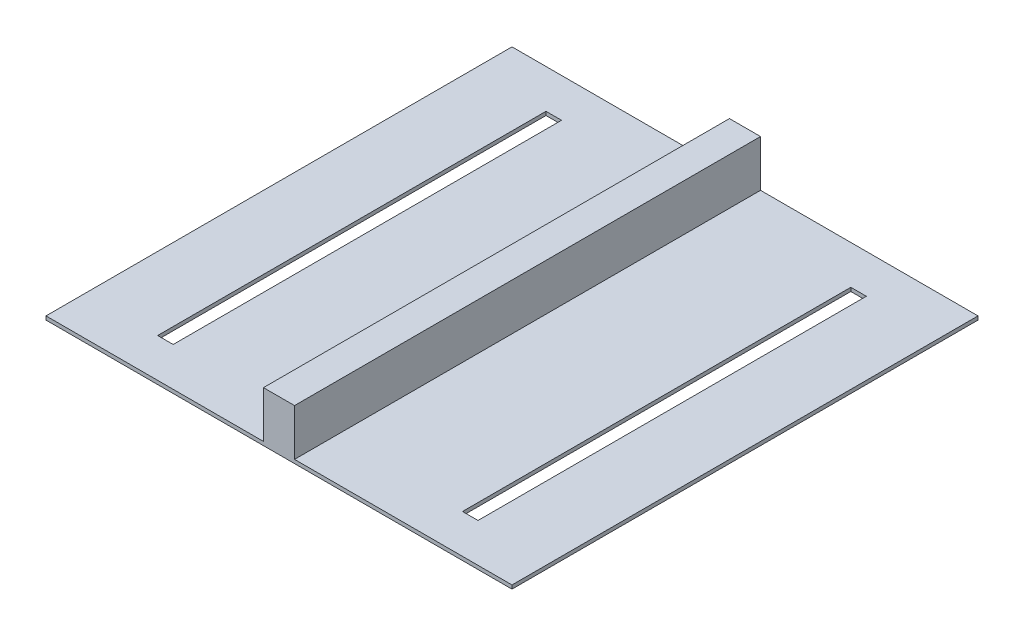
ISO-10303-21;
HEADER;
FILE_DESCRIPTION(('STEP AP214'),'2;1');
FILE_NAME('part.step','',(''),(''),'','','');
FILE_SCHEMA(('AUTOMOTIVE_DESIGN { 1 0 10303 214 1 1 1 1 }'));
ENDSEC;
DATA;
#1=APPLICATION_CONTEXT('core data for automotive mechanical design processes');
#2=APPLICATION_PROTOCOL_DEFINITION('international standard','automotive_design',2000,#1);
#3=PRODUCT_CONTEXT('',#1,'mechanical');
#4=PRODUCT('Part','Part','',(#3));
#5=PRODUCT_RELATED_PRODUCT_CATEGORY('part','',(#4));
#6=PRODUCT_DEFINITION_FORMATION('','',#4);
#7=PRODUCT_DEFINITION_CONTEXT('part definition',#1,'design');
#8=PRODUCT_DEFINITION('design','',#6,#7);
#9=PRODUCT_DEFINITION_SHAPE('','',#8);
#10=(LENGTH_UNIT() NAMED_UNIT(*) SI_UNIT(.MILLI.,.METRE.));
#11=(NAMED_UNIT(*) PLANE_ANGLE_UNIT() SI_UNIT($,.RADIAN.));
#12=(NAMED_UNIT(*) SI_UNIT($,.STERADIAN.) SOLID_ANGLE_UNIT());
#13=UNCERTAINTY_MEASURE_WITH_UNIT(LENGTH_MEASURE(1.E-05),#10,'distance_accuracy_value','');
#14=(GEOMETRIC_REPRESENTATION_CONTEXT(3) GLOBAL_UNCERTAINTY_ASSIGNED_CONTEXT((#13)) GLOBAL_UNIT_ASSIGNED_CONTEXT((#10,
#11,#12)) REPRESENTATION_CONTEXT('',''));
#15=CARTESIAN_POINT('',(0.,0.,0.));
#16=DIRECTION('',(0.,0.,1.));
#17=DIRECTION('',(1.,0.,0.));
#18=AXIS2_PLACEMENT_3D('',#15,#16,#17);
#19=CARTESIAN_POINT('',(0.,3.,0.));
#20=DIRECTION('',(0.,1.,0.));
#21=DIRECTION('',(0.,0.,1.));
#22=AXIS2_PLACEMENT_3D('',#19,#20,#21);
#23=PLANE('',#22);
#24=DIRECTION('',(0.,0.,1.));
#25=VECTOR('',#24,1.);
#26=CARTESIAN_POINT('',(-25.4,3.,-381.));
#27=LINE('',#26,#25);
#28=CARTESIAN_POINT('',(-25.4,3.,-381.));
#29=VERTEX_POINT('',#28);
#30=CARTESIAN_POINT('',(-25.4,3.,381.));
#31=VERTEX_POINT('',#30);
#32=EDGE_CURVE('E57',#29,#31,#27,.T.);
#33=ORIENTED_EDGE('',*,*,#32,.F.);
#34=DIRECTION('',(-1.,0.,0.));
#35=VECTOR('',#34,1.);
#36=CARTESIAN_POINT('',(-381.,3.,-381.));
#37=LINE('',#36,#35);
#38=CARTESIAN_POINT('',(-381.,3.,-381.));
#39=VERTEX_POINT('',#38);
#40=EDGE_CURVE('E284',#29,#39,#37,.T.);
#41=ORIENTED_EDGE('',*,*,#40,.T.);
#42=DIRECTION('',(0.,0.,1.));
#43=VECTOR('',#42,1.);
#44=CARTESIAN_POINT('',(-381.,3.,-381.));
#45=LINE('',#44,#43);
#46=CARTESIAN_POINT('',(-381.,3.,381.));
#47=VERTEX_POINT('',#46);
#48=EDGE_CURVE('E272',#39,#47,#45,.T.);
#49=ORIENTED_EDGE('',*,*,#48,.T.);
#50=DIRECTION('',(1.,0.,0.));
#51=VECTOR('',#50,1.);
#52=CARTESIAN_POINT('',(-381.,3.,381.));
#53=LINE('',#52,#51);
#54=EDGE_CURVE('E278',#47,#31,#53,.T.);
#55=ORIENTED_EDGE('',*,*,#54,.T.);
#56=EDGE_LOOP('',(#33,#41,#49,#55));
#57=FACE_BOUND('',#56,.T.);
#58=DIRECTION('',(1.,0.,0.));
#59=VECTOR('',#58,1.);
#60=CARTESIAN_POINT('',(-261.9248,3.,317.5));
#61=LINE('',#60,#59);
#62=CARTESIAN_POINT('',(-261.9248,3.,317.5));
#63=VERTEX_POINT('',#62);
#64=CARTESIAN_POINT('',(-236.5248,3.,317.5));
#65=VERTEX_POINT('',#64);
#66=EDGE_CURVE('E232',#63,#65,#61,.T.);
#67=ORIENTED_EDGE('',*,*,#66,.F.);
#68=DIRECTION('',(0.,0.,1.));
#69=VECTOR('',#68,1.);
#70=CARTESIAN_POINT('',(-261.9248,3.,-317.5));
#71=LINE('',#70,#69);
#72=CARTESIAN_POINT('',(-261.9248,3.,-317.5));
#73=VERTEX_POINT('',#72);
#74=EDGE_CURVE('E229',#73,#63,#71,.T.);
#75=ORIENTED_EDGE('',*,*,#74,.F.);
#76=DIRECTION('',(-1.,0.,0.));
#77=VECTOR('',#76,1.);
#78=CARTESIAN_POINT('',(-261.9248,3.,-317.5));
#79=LINE('',#78,#77);
#80=CARTESIAN_POINT('',(-236.5248,3.,-317.5));
#81=VERTEX_POINT('',#80);
#82=EDGE_CURVE('E240',#81,#73,#79,.T.);
#83=ORIENTED_EDGE('',*,*,#82,.F.);
#84=DIRECTION('',(0.,0.,-1.));
#85=VECTOR('',#84,1.);
#86=CARTESIAN_POINT('',(-236.5248,3.,-317.5));
#87=LINE('',#86,#85);
#88=EDGE_CURVE('E236',#65,#81,#87,.T.);
#89=ORIENTED_EDGE('',*,*,#88,.F.);
#90=EDGE_LOOP('',(#67,#75,#83,#89));
#91=FACE_BOUND('',#90,.T.);
#92=ADVANCED_FACE('F41',(#57,#91),#23,.T.);
#93=DIRECTION('',(0.,0.,-1.));
#94=VECTOR('',#93,1.);
#95=CARTESIAN_POINT('',(25.4,3.,-381.));
#96=LINE('',#95,#94);
#97=CARTESIAN_POINT('',(25.4,3.,381.));
#98=VERTEX_POINT('',#97);
#99=CARTESIAN_POINT('',(25.4,3.,-381.));
#100=VERTEX_POINT('',#99);
#101=EDGE_CURVE('E65',#98,#100,#96,.T.);
#102=ORIENTED_EDGE('',*,*,#101,.F.);
#103=CARTESIAN_POINT('',(381.,3.,381.));
#104=VERTEX_POINT('',#103);
#105=EDGE_CURVE('E276',#98,#104,#53,.T.);
#106=ORIENTED_EDGE('',*,*,#105,.T.);
#107=DIRECTION('',(0.,0.,-1.));
#108=VECTOR('',#107,1.);
#109=CARTESIAN_POINT('',(381.,3.,-381.));
#110=LINE('',#109,#108);
#111=CARTESIAN_POINT('',(381.,3.,-381.));
#112=VERTEX_POINT('',#111);
#113=EDGE_CURVE('E281',#104,#112,#110,.T.);
#114=ORIENTED_EDGE('',*,*,#113,.T.);
#115=EDGE_CURVE('E285',#112,#100,#37,.T.);
#116=ORIENTED_EDGE('',*,*,#115,.T.);
#117=EDGE_LOOP('',(#102,#106,#114,#116));
#118=FACE_BOUND('',#117,.T.);
#119=DIRECTION('',(1.,0.,0.));
#120=VECTOR('',#119,1.);
#121=CARTESIAN_POINT('',(236.5248,3.,317.5));
#122=LINE('',#121,#120);
#123=CARTESIAN_POINT('',(236.5248,3.,317.5));
#124=VERTEX_POINT('',#123);
#125=CARTESIAN_POINT('',(261.9248,3.,317.5));
#126=VERTEX_POINT('',#125);
#127=EDGE_CURVE('E193',#124,#126,#122,.T.);
#128=ORIENTED_EDGE('',*,*,#127,.F.);
#129=DIRECTION('',(0.,0.,1.));
#130=VECTOR('',#129,1.);
#131=CARTESIAN_POINT('',(236.5248,3.,-317.5));
#132=LINE('',#131,#130);
#133=CARTESIAN_POINT('',(236.5248,3.,-317.5));
#134=VERTEX_POINT('',#133);
#135=EDGE_CURVE('E190',#134,#124,#132,.T.);
#136=ORIENTED_EDGE('',*,*,#135,.F.);
#137=DIRECTION('',(-1.,0.,0.));
#138=VECTOR('',#137,1.);
#139=CARTESIAN_POINT('',(236.5248,3.,-317.5));
#140=LINE('',#139,#138);
#141=CARTESIAN_POINT('',(261.9248,3.,-317.5));
#142=VERTEX_POINT('',#141);
#143=EDGE_CURVE('E201',#142,#134,#140,.T.);
#144=ORIENTED_EDGE('',*,*,#143,.F.);
#145=DIRECTION('',(0.,0.,-1.));
#146=VECTOR('',#145,1.);
#147=CARTESIAN_POINT('',(261.9248,3.,-317.5));
#148=LINE('',#147,#146);
#149=EDGE_CURVE('E197',#126,#142,#148,.T.);
#150=ORIENTED_EDGE('',*,*,#149,.F.);
#151=EDGE_LOOP('',(#128,#136,#144,#150));
#152=FACE_BOUND('',#151,.T.);
#153=ADVANCED_FACE('F329',(#118,#152),#23,.T.);
#154=CARTESIAN_POINT('',(0.,-3.,0.));
#155=DIRECTION('',(0.,1.,0.));
#156=DIRECTION('',(0.,0.,1.));
#157=AXIS2_PLACEMENT_3D('',#154,#155,#156);
#158=PLANE('',#157);
#159=DIRECTION('',(0.,0.,1.));
#160=VECTOR('',#159,1.);
#161=CARTESIAN_POINT('',(-261.9248,-3.,-317.5));
#162=LINE('',#161,#160);
#163=CARTESIAN_POINT('',(-261.9248,-3.,-317.5));
#164=VERTEX_POINT('',#163);
#165=CARTESIAN_POINT('',(-261.9248,-3.,317.5));
#166=VERTEX_POINT('',#165);
#167=EDGE_CURVE('E228',#164,#166,#162,.T.);
#168=ORIENTED_EDGE('',*,*,#167,.T.);
#169=DIRECTION('',(1.,0.,0.));
#170=VECTOR('',#169,1.);
#171=CARTESIAN_POINT('',(-261.9248,-3.,317.5));
#172=LINE('',#171,#170);
#173=CARTESIAN_POINT('',(-236.5248,-3.,317.5));
#174=VERTEX_POINT('',#173);
#175=EDGE_CURVE('E247',#166,#174,#172,.T.);
#176=ORIENTED_EDGE('',*,*,#175,.T.);
#177=DIRECTION('',(0.,0.,-1.));
#178=VECTOR('',#177,1.);
#179=CARTESIAN_POINT('',(-236.5248,-3.,-317.5));
#180=LINE('',#179,#178);
#181=CARTESIAN_POINT('',(-236.5248,-3.,-317.5));
#182=VERTEX_POINT('',#181);
#183=EDGE_CURVE('E251',#174,#182,#180,.T.);
#184=ORIENTED_EDGE('',*,*,#183,.T.);
#185=DIRECTION('',(-1.,0.,0.));
#186=VECTOR('',#185,1.);
#187=CARTESIAN_POINT('',(-261.9248,-3.,-317.5));
#188=LINE('',#187,#186);
#189=EDGE_CURVE('E233',#182,#164,#188,.T.);
#190=ORIENTED_EDGE('',*,*,#189,.T.);
#191=EDGE_LOOP('',(#168,#176,#184,#190));
#192=FACE_BOUND('',#191,.T.);
#193=DIRECTION('',(0.,0.,1.));
#194=VECTOR('',#193,1.);
#195=CARTESIAN_POINT('',(-381.,-3.,-381.));
#196=LINE('',#195,#194);
#197=CARTESIAN_POINT('',(-381.,-3.,-381.));
#198=VERTEX_POINT('',#197);
#199=CARTESIAN_POINT('',(-381.,-3.,381.));
#200=VERTEX_POINT('',#199);
#201=EDGE_CURVE('E271',#198,#200,#196,.T.);
#202=ORIENTED_EDGE('',*,*,#201,.F.);
#203=DIRECTION('',(-1.,0.,0.));
#204=VECTOR('',#203,1.);
#205=CARTESIAN_POINT('',(-381.,-3.,-381.));
#206=LINE('',#205,#204);
#207=CARTESIAN_POINT('',(381.,-3.,-381.));
#208=VERTEX_POINT('',#207);
#209=EDGE_CURVE('E277',#208,#198,#206,.T.);
#210=ORIENTED_EDGE('',*,*,#209,.F.);
#211=DIRECTION('',(0.,0.,-1.));
#212=VECTOR('',#211,1.);
#213=CARTESIAN_POINT('',(381.,-3.,-381.));
#214=LINE('',#213,#212);
#215=CARTESIAN_POINT('',(381.,-3.,381.));
#216=VERTEX_POINT('',#215);
#217=EDGE_CURVE('E295',#216,#208,#214,.T.);
#218=ORIENTED_EDGE('',*,*,#217,.F.);
#219=DIRECTION('',(1.,0.,0.));
#220=VECTOR('',#219,1.);
#221=CARTESIAN_POINT('',(-381.,-3.,381.));
#222=LINE('',#221,#220);
#223=EDGE_CURVE('E292',#200,#216,#222,.T.);
#224=ORIENTED_EDGE('',*,*,#223,.F.);
#225=EDGE_LOOP('',(#202,#210,#218,#224));
#226=FACE_BOUND('',#225,.T.);
#227=DIRECTION('',(0.,0.,1.));
#228=VECTOR('',#227,1.);
#229=CARTESIAN_POINT('',(236.5248,-3.,-317.5));
#230=LINE('',#229,#228);
#231=CARTESIAN_POINT('',(236.5248,-3.,-317.5));
#232=VERTEX_POINT('',#231);
#233=CARTESIAN_POINT('',(236.5248,-3.,317.5));
#234=VERTEX_POINT('',#233);
#235=EDGE_CURVE('E179',#232,#234,#230,.T.);
#236=ORIENTED_EDGE('',*,*,#235,.T.);
#237=DIRECTION('',(1.,0.,0.));
#238=VECTOR('',#237,1.);
#239=CARTESIAN_POINT('',(236.5248,-3.,317.5));
#240=LINE('',#239,#238);
#241=CARTESIAN_POINT('',(261.9248,-3.,317.5));
#242=VERTEX_POINT('',#241);
#243=EDGE_CURVE('E184',#234,#242,#240,.T.);
#244=ORIENTED_EDGE('',*,*,#243,.T.);
#245=DIRECTION('',(0.,0.,-1.));
#246=VECTOR('',#245,1.);
#247=CARTESIAN_POINT('',(261.9248,-3.,-317.5));
#248=LINE('',#247,#246);
#249=CARTESIAN_POINT('',(261.9248,-3.,-317.5));
#250=VERTEX_POINT('',#249);
#251=EDGE_CURVE('E208',#242,#250,#248,.T.);
#252=ORIENTED_EDGE('',*,*,#251,.T.);
#253=DIRECTION('',(-1.,0.,0.));
#254=VECTOR('',#253,1.);
#255=CARTESIAN_POINT('',(236.5248,-3.,-317.5));
#256=LINE('',#255,#254);
#257=EDGE_CURVE('E194',#250,#232,#256,.T.);
#258=ORIENTED_EDGE('',*,*,#257,.T.);
#259=EDGE_LOOP('',(#236,#244,#252,#258));
#260=FACE_BOUND('',#259,.T.);
#261=ADVANCED_FACE('F317',(#192,#226,#260),#158,.F.);
#262=CARTESIAN_POINT('',(-381.,3.,-381.));
#263=DIRECTION('',(1.,0.,0.));
#264=DIRECTION('',(0.,0.,-1.));
#265=AXIS2_PLACEMENT_3D('',#262,#263,#264);
#266=PLANE('',#265);
#267=ORIENTED_EDGE('',*,*,#201,.T.);
#268=DIRECTION('',(0.,-1.,0.));
#269=VECTOR('',#268,1.);
#270=CARTESIAN_POINT('',(-381.,3.,381.));
#271=LINE('',#270,#269);
#272=EDGE_CURVE('E11',#47,#200,#271,.T.);
#273=ORIENTED_EDGE('',*,*,#272,.F.);
#274=ORIENTED_EDGE('',*,*,#48,.F.);
#275=DIRECTION('',(0.,-1.,0.));
#276=VECTOR('',#275,1.);
#277=CARTESIAN_POINT('',(-381.,3.,-381.));
#278=LINE('',#277,#276);
#279=EDGE_CURVE('E288',#39,#198,#278,.T.);
#280=ORIENTED_EDGE('',*,*,#279,.T.);
#281=EDGE_LOOP('',(#267,#273,#274,#280));
#282=FACE_BOUND('',#281,.T.);
#283=ADVANCED_FACE('F43',(#282),#266,.F.);
#284=CARTESIAN_POINT('',(-381.,3.,381.));
#285=DIRECTION('',(0.,0.,-1.));
#286=DIRECTION('',(-1.,0.,0.));
#287=AXIS2_PLACEMENT_3D('',#284,#285,#286);
#288=PLANE('',#287);
#289=ORIENTED_EDGE('',*,*,#223,.T.);
#290=DIRECTION('',(0.,-1.,0.));
#291=VECTOR('',#290,1.);
#292=CARTESIAN_POINT('',(381.,3.,381.));
#293=LINE('',#292,#291);
#294=EDGE_CURVE('E50',#104,#216,#293,.T.);
#295=ORIENTED_EDGE('',*,*,#294,.F.);
#296=ORIENTED_EDGE('',*,*,#105,.F.);
#297=DIRECTION('',(0.,-1.,0.));
#298=VECTOR('',#297,1.);
#299=CARTESIAN_POINT('',(25.4000000000001,79.2,381.));
#300=LINE('',#299,#298);
#301=CARTESIAN_POINT('',(25.4000000000001,79.2,381.));
#302=VERTEX_POINT('',#301);
#303=EDGE_CURVE('E161',#302,#98,#300,.T.);
#304=ORIENTED_EDGE('',*,*,#303,.F.);
#305=DIRECTION('',(1.,0.,0.));
#306=VECTOR('',#305,1.);
#307=CARTESIAN_POINT('',(-25.4,79.2,381.));
#308=LINE('',#307,#306);
#309=CARTESIAN_POINT('',(-25.4,79.2,381.));
#310=VERTEX_POINT('',#309);
#311=EDGE_CURVE('E155',#310,#302,#308,.T.);
#312=ORIENTED_EDGE('',*,*,#311,.F.);
#313=DIRECTION('',(0.,-1.,0.));
#314=VECTOR('',#313,1.);
#315=CARTESIAN_POINT('',(-25.4,79.2,381.));
#316=LINE('',#315,#314);
#317=EDGE_CURVE('E159',#310,#31,#316,.T.);
#318=ORIENTED_EDGE('',*,*,#317,.T.);
#319=ORIENTED_EDGE('',*,*,#54,.F.);
#320=ORIENTED_EDGE('',*,*,#272,.T.);
#321=EDGE_LOOP('',(#289,#295,#296,#304,#312,#318,#319,#320));
#322=FACE_BOUND('',#321,.T.);
#323=ADVANCED_FACE('F157',(#322),#288,.F.);
#324=CARTESIAN_POINT('',(381.,3.,-381.));
#325=DIRECTION('',(-1.,0.,0.));
#326=DIRECTION('',(0.,0.,1.));
#327=AXIS2_PLACEMENT_3D('',#324,#325,#326);
#328=PLANE('',#327);
#329=ORIENTED_EDGE('',*,*,#217,.T.);
#330=DIRECTION('',(0.,-1.,0.));
#331=VECTOR('',#330,1.);
#332=CARTESIAN_POINT('',(381.,3.,-381.));
#333=LINE('',#332,#331);
#334=EDGE_CURVE('E303',#112,#208,#333,.T.);
#335=ORIENTED_EDGE('',*,*,#334,.F.);
#336=ORIENTED_EDGE('',*,*,#113,.F.);
#337=ORIENTED_EDGE('',*,*,#294,.T.);
#338=EDGE_LOOP('',(#329,#335,#336,#337));
#339=FACE_BOUND('',#338,.T.);
#340=ADVANCED_FACE('F312',(#339),#328,.F.);
#341=CARTESIAN_POINT('',(-381.,3.,-381.));
#342=DIRECTION('',(0.,0.,1.));
#343=DIRECTION('',(1.,0.,0.));
#344=AXIS2_PLACEMENT_3D('',#341,#342,#343);
#345=PLANE('',#344);
#346=ORIENTED_EDGE('',*,*,#209,.T.);
#347=ORIENTED_EDGE('',*,*,#279,.F.);
#348=ORIENTED_EDGE('',*,*,#40,.F.);
#349=DIRECTION('',(0.,-1.,0.));
#350=VECTOR('',#349,1.);
#351=CARTESIAN_POINT('',(-25.4,79.2,-381.));
#352=LINE('',#351,#350);
#353=CARTESIAN_POINT('',(-25.4,79.2,-381.));
#354=VERTEX_POINT('',#353);
#355=EDGE_CURVE('E338',#354,#29,#352,.T.);
#356=ORIENTED_EDGE('',*,*,#355,.F.);
#357=DIRECTION('',(-1.,0.,0.));
#358=VECTOR('',#357,1.);
#359=CARTESIAN_POINT('',(-25.4,79.2,-381.));
#360=LINE('',#359,#358);
#361=CARTESIAN_POINT('',(25.4,79.2,-381.));
#362=VERTEX_POINT('',#361);
#363=EDGE_CURVE('E171',#362,#354,#360,.T.);
#364=ORIENTED_EDGE('',*,*,#363,.F.);
#365=DIRECTION('',(0.,-1.,0.));
#366=VECTOR('',#365,1.);
#367=CARTESIAN_POINT('',(25.4,79.2,-381.));
#368=LINE('',#367,#366);
#369=EDGE_CURVE('E186',#362,#100,#368,.T.);
#370=ORIENTED_EDGE('',*,*,#369,.T.);
#371=ORIENTED_EDGE('',*,*,#115,.F.);
#372=ORIENTED_EDGE('',*,*,#334,.T.);
#373=EDGE_LOOP('',(#346,#347,#348,#356,#364,#370,#371,#372));
#374=FACE_BOUND('',#373,.T.);
#375=ADVANCED_FACE('F321',(#374),#345,.F.);
#376=CARTESIAN_POINT('',(-261.9248,3.,-317.5));
#377=DIRECTION('',(1.,0.,0.));
#378=DIRECTION('',(0.,0.,-1.));
#379=AXIS2_PLACEMENT_3D('',#376,#377,#378);
#380=PLANE('',#379);
#381=ORIENTED_EDGE('',*,*,#167,.F.);
#382=DIRECTION('',(0.,-1.,0.));
#383=VECTOR('',#382,1.);
#384=CARTESIAN_POINT('',(-261.9248,3.,-317.5));
#385=LINE('',#384,#383);
#386=EDGE_CURVE('E243',#73,#164,#385,.T.);
#387=ORIENTED_EDGE('',*,*,#386,.F.);
#388=ORIENTED_EDGE('',*,*,#74,.T.);
#389=DIRECTION('',(0.,-1.,0.));
#390=VECTOR('',#389,1.);
#391=CARTESIAN_POINT('',(-261.9248,3.,317.5));
#392=LINE('',#391,#390);
#393=EDGE_CURVE('E267',#63,#166,#392,.T.);
#394=ORIENTED_EDGE('',*,*,#393,.T.);
#395=EDGE_LOOP('',(#381,#387,#388,#394));
#396=FACE_BOUND('',#395,.T.);
#397=ADVANCED_FACE('F363',(#396),#380,.T.);
#398=CARTESIAN_POINT('',(-261.9248,3.,317.5));
#399=DIRECTION('',(0.,0.,-1.));
#400=DIRECTION('',(-1.,0.,0.));
#401=AXIS2_PLACEMENT_3D('',#398,#399,#400);
#402=PLANE('',#401);
#403=ORIENTED_EDGE('',*,*,#175,.F.);
#404=ORIENTED_EDGE('',*,*,#393,.F.);
#405=ORIENTED_EDGE('',*,*,#66,.T.);
#406=DIRECTION('',(0.,-1.,0.));
#407=VECTOR('',#406,1.);
#408=CARTESIAN_POINT('',(-236.5248,3.,317.5));
#409=LINE('',#408,#407);
#410=EDGE_CURVE('E264',#65,#174,#409,.T.);
#411=ORIENTED_EDGE('',*,*,#410,.T.);
#412=EDGE_LOOP('',(#403,#404,#405,#411));
#413=FACE_BOUND('',#412,.T.);
#414=ADVANCED_FACE('F465',(#413),#402,.T.);
#415=CARTESIAN_POINT('',(-236.5248,3.,-317.5));
#416=DIRECTION('',(-1.,0.,0.));
#417=DIRECTION('',(0.,0.,1.));
#418=AXIS2_PLACEMENT_3D('',#415,#416,#417);
#419=PLANE('',#418);
#420=ORIENTED_EDGE('',*,*,#183,.F.);
#421=ORIENTED_EDGE('',*,*,#410,.F.);
#422=ORIENTED_EDGE('',*,*,#88,.T.);
#423=DIRECTION('',(0.,-1.,0.));
#424=VECTOR('',#423,1.);
#425=CARTESIAN_POINT('',(-236.5248,3.,-317.5));
#426=LINE('',#425,#424);
#427=EDGE_CURVE('E261',#81,#182,#426,.T.);
#428=ORIENTED_EDGE('',*,*,#427,.T.);
#429=EDGE_LOOP('',(#420,#421,#422,#428));
#430=FACE_BOUND('',#429,.T.);
#431=ADVANCED_FACE('F457',(#430),#419,.T.);
#432=CARTESIAN_POINT('',(-261.9248,3.,-317.5));
#433=DIRECTION('',(0.,0.,1.));
#434=DIRECTION('',(1.,0.,0.));
#435=AXIS2_PLACEMENT_3D('',#432,#433,#434);
#436=PLANE('',#435);
#437=ORIENTED_EDGE('',*,*,#189,.F.);
#438=ORIENTED_EDGE('',*,*,#427,.F.);
#439=ORIENTED_EDGE('',*,*,#82,.T.);
#440=ORIENTED_EDGE('',*,*,#386,.T.);
#441=EDGE_LOOP('',(#437,#438,#439,#440));
#442=FACE_BOUND('',#441,.T.);
#443=ADVANCED_FACE('F449',(#442),#436,.T.);
#444=CARTESIAN_POINT('',(236.5248,3.,-317.5));
#445=DIRECTION('',(1.,0.,0.));
#446=DIRECTION('',(0.,0.,-1.));
#447=AXIS2_PLACEMENT_3D('',#444,#445,#446);
#448=PLANE('',#447);
#449=ORIENTED_EDGE('',*,*,#235,.F.);
#450=DIRECTION('',(0.,-1.,0.));
#451=VECTOR('',#450,1.);
#452=CARTESIAN_POINT('',(236.5248,3.,-317.5));
#453=LINE('',#452,#451);
#454=EDGE_CURVE('E203',#134,#232,#453,.T.);
#455=ORIENTED_EDGE('',*,*,#454,.F.);
#456=ORIENTED_EDGE('',*,*,#135,.T.);
#457=DIRECTION('',(0.,-1.,0.));
#458=VECTOR('',#457,1.);
#459=CARTESIAN_POINT('',(236.5248,3.,317.5));
#460=LINE('',#459,#458);
#461=EDGE_CURVE('E224',#124,#234,#460,.T.);
#462=ORIENTED_EDGE('',*,*,#461,.T.);
#463=EDGE_LOOP('',(#449,#455,#456,#462));
#464=FACE_BOUND('',#463,.T.);
#465=ADVANCED_FACE('F441',(#464),#448,.T.);
#466=CARTESIAN_POINT('',(236.5248,3.,317.5));
#467=DIRECTION('',(0.,0.,-1.));
#468=DIRECTION('',(-1.,0.,0.));
#469=AXIS2_PLACEMENT_3D('',#466,#467,#468);
#470=PLANE('',#469);
#471=ORIENTED_EDGE('',*,*,#243,.F.);
#472=ORIENTED_EDGE('',*,*,#461,.F.);
#473=ORIENTED_EDGE('',*,*,#127,.T.);
#474=DIRECTION('',(0.,-1.,0.));
#475=VECTOR('',#474,1.);
#476=CARTESIAN_POINT('',(261.9248,3.,317.5));
#477=LINE('',#476,#475);
#478=EDGE_CURVE('E221',#126,#242,#477,.T.);
#479=ORIENTED_EDGE('',*,*,#478,.T.);
#480=EDGE_LOOP('',(#471,#472,#473,#479));
#481=FACE_BOUND('',#480,.T.);
#482=ADVANCED_FACE('F433',(#481),#470,.T.);
#483=CARTESIAN_POINT('',(261.9248,3.,-317.5));
#484=DIRECTION('',(-1.,0.,0.));
#485=DIRECTION('',(0.,0.,1.));
#486=AXIS2_PLACEMENT_3D('',#483,#484,#485);
#487=PLANE('',#486);
#488=ORIENTED_EDGE('',*,*,#251,.F.);
#489=ORIENTED_EDGE('',*,*,#478,.F.);
#490=ORIENTED_EDGE('',*,*,#149,.T.);
#491=DIRECTION('',(0.,-1.,0.));
#492=VECTOR('',#491,1.);
#493=CARTESIAN_POINT('',(261.9248,3.,-317.5));
#494=LINE('',#493,#492);
#495=EDGE_CURVE('E218',#142,#250,#494,.T.);
#496=ORIENTED_EDGE('',*,*,#495,.T.);
#497=EDGE_LOOP('',(#488,#489,#490,#496));
#498=FACE_BOUND('',#497,.T.);
#499=ADVANCED_FACE('F425',(#498),#487,.T.);
#500=CARTESIAN_POINT('',(236.5248,3.,-317.5));
#501=DIRECTION('',(0.,0.,1.));
#502=DIRECTION('',(1.,0.,0.));
#503=AXIS2_PLACEMENT_3D('',#500,#501,#502);
#504=PLANE('',#503);
#505=ORIENTED_EDGE('',*,*,#257,.F.);
#506=ORIENTED_EDGE('',*,*,#495,.F.);
#507=ORIENTED_EDGE('',*,*,#143,.T.);
#508=ORIENTED_EDGE('',*,*,#454,.T.);
#509=EDGE_LOOP('',(#505,#506,#507,#508));
#510=FACE_BOUND('',#509,.T.);
#511=ADVANCED_FACE('F354',(#510),#504,.T.);
#512=CARTESIAN_POINT('',(-25.4,79.2,-381.));
#513=DIRECTION('',(1.,0.,0.));
#514=DIRECTION('',(0.,0.,-1.));
#515=AXIS2_PLACEMENT_3D('',#512,#513,#514);
#516=PLANE('',#515);
#517=ORIENTED_EDGE('',*,*,#32,.T.);
#518=ORIENTED_EDGE('',*,*,#317,.F.);
#519=DIRECTION('',(0.,0.,1.));
#520=VECTOR('',#519,1.);
#521=CARTESIAN_POINT('',(-25.4,79.2,-381.));
#522=LINE('',#521,#520);
#523=EDGE_CURVE('E166',#354,#310,#522,.T.);
#524=ORIENTED_EDGE('',*,*,#523,.F.);
#525=ORIENTED_EDGE('',*,*,#355,.T.);
#526=EDGE_LOOP('',(#517,#518,#524,#525));
#527=FACE_BOUND('',#526,.T.);
#528=ADVANCED_FACE('F177',(#527),#516,.F.);
#529=CARTESIAN_POINT('',(25.4,79.2,-381.));
#530=DIRECTION('',(-1.,0.,0.));
#531=DIRECTION('',(0.,0.,1.));
#532=AXIS2_PLACEMENT_3D('',#529,#530,#531);
#533=PLANE('',#532);
#534=ORIENTED_EDGE('',*,*,#101,.T.);
#535=ORIENTED_EDGE('',*,*,#369,.F.);
#536=DIRECTION('',(0.,0.,-1.));
#537=VECTOR('',#536,1.);
#538=CARTESIAN_POINT('',(25.4,79.2,-381.));
#539=LINE('',#538,#537);
#540=EDGE_CURVE('E165',#302,#362,#539,.T.);
#541=ORIENTED_EDGE('',*,*,#540,.F.);
#542=ORIENTED_EDGE('',*,*,#303,.T.);
#543=EDGE_LOOP('',(#534,#535,#541,#542));
#544=FACE_BOUND('',#543,.T.);
#545=ADVANCED_FACE('F332',(#544),#533,.F.);
#546=CARTESIAN_POINT('',(0.,79.2,0.));
#547=DIRECTION('',(0.,1.,0.));
#548=DIRECTION('',(0.,0.,1.));
#549=AXIS2_PLACEMENT_3D('',#546,#547,#548);
#550=PLANE('',#549);
#551=ORIENTED_EDGE('',*,*,#523,.T.);
#552=ORIENTED_EDGE('',*,*,#311,.T.);
#553=ORIENTED_EDGE('',*,*,#540,.T.);
#554=ORIENTED_EDGE('',*,*,#363,.T.);
#555=EDGE_LOOP('',(#551,#552,#553,#554));
#556=FACE_BOUND('',#555,.T.);
#557=ADVANCED_FACE('F169',(#556),#550,.T.);
#558=CLOSED_SHELL('',(#92,#153,#261,#283,#323,#340,#375,#397,#414,#431,#443,#465,#482,#499,#511,
#528,#545,#557));
#559=MANIFOLD_SOLID_BREP('B2',#558);
#560=ADVANCED_BREP_SHAPE_REPRESENTATION('',(#18,#559),#14);
#561=SHAPE_DEFINITION_REPRESENTATION(#9,#560);
ENDSEC;
END-ISO-10303-21;
